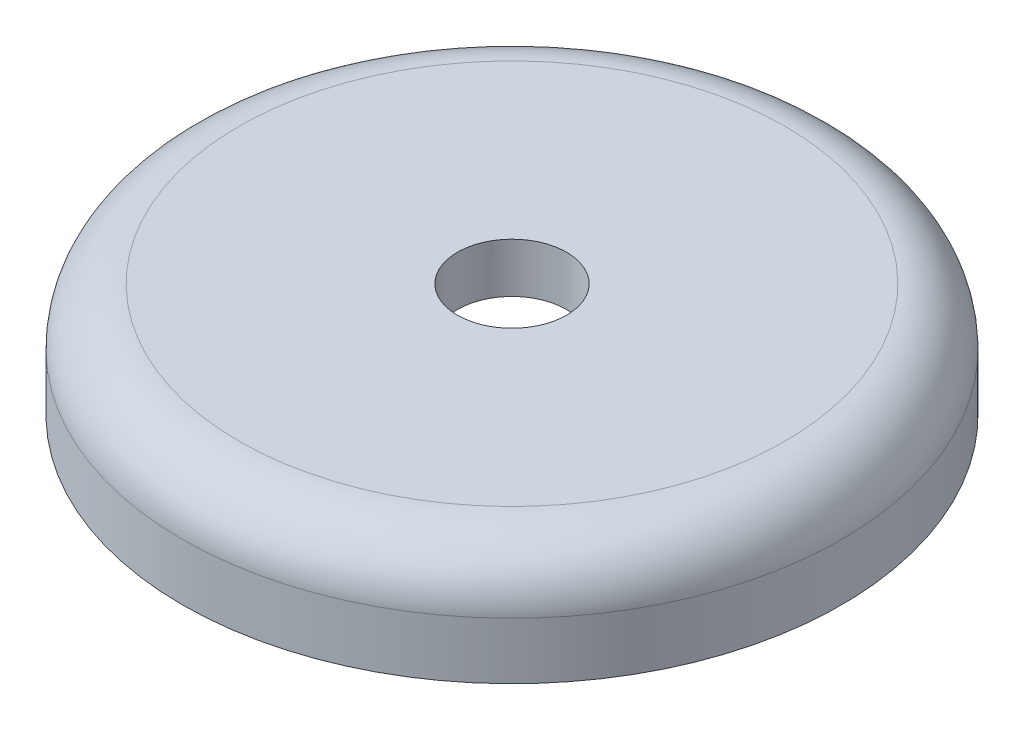
ISO-10303-21;
HEADER;
FILE_DESCRIPTION(('STEP AP214'),'2;1');
FILE_NAME('part.step','',(''),(''),'','','');
FILE_SCHEMA(('AUTOMOTIVE_DESIGN { 1 0 10303 214 1 1 1 1 }'));
ENDSEC;
DATA;
#1=APPLICATION_CONTEXT('core data for automotive mechanical design processes');
#2=APPLICATION_PROTOCOL_DEFINITION('international standard','automotive_design',2000,#1);
#3=PRODUCT_CONTEXT('',#1,'mechanical');
#4=PRODUCT('Part','Part','',(#3));
#5=PRODUCT_RELATED_PRODUCT_CATEGORY('part','',(#4));
#6=PRODUCT_DEFINITION_FORMATION('','',#4);
#7=PRODUCT_DEFINITION_CONTEXT('part definition',#1,'design');
#8=PRODUCT_DEFINITION('design','',#6,#7);
#9=PRODUCT_DEFINITION_SHAPE('','',#8);
#10=(LENGTH_UNIT() NAMED_UNIT(*) SI_UNIT(.MILLI.,.METRE.));
#11=(NAMED_UNIT(*) PLANE_ANGLE_UNIT() SI_UNIT($,.RADIAN.));
#12=(NAMED_UNIT(*) SI_UNIT($,.STERADIAN.) SOLID_ANGLE_UNIT());
#13=UNCERTAINTY_MEASURE_WITH_UNIT(LENGTH_MEASURE(1.E-05),#10,'distance_accuracy_value','');
#14=(GEOMETRIC_REPRESENTATION_CONTEXT(3) GLOBAL_UNCERTAINTY_ASSIGNED_CONTEXT((#13)) GLOBAL_UNIT_ASSIGNED_CONTEXT((#10,
#11,#12)) REPRESENTATION_CONTEXT('',''));
#15=CARTESIAN_POINT('',(0.,0.,0.));
#16=DIRECTION('',(0.,0.,1.));
#17=DIRECTION('',(1.,0.,0.));
#18=AXIS2_PLACEMENT_3D('',#15,#16,#17);
#19=CARTESIAN_POINT('',(0.,0.,0.));
#20=DIRECTION('',(0.,1.,0.));
#21=DIRECTION('',(0.,0.,1.));
#22=AXIS2_PLACEMENT_3D('',#19,#20,#21);
#23=CYLINDRICAL_SURFACE('',#22,9.779);
#24=CARTESIAN_POINT('',(0.,20.32,0.));
#25=DIRECTION('',(0.,1.,0.));
#26=DIRECTION('',(0.,0.,1.));
#27=AXIS2_PLACEMENT_3D('',#24,#25,#26);
#28=CIRCLE('',#27,9.779);
#29=CARTESIAN_POINT('',(0.,20.32,9.779));
#30=VERTEX_POINT('',#29);
#31=EDGE_CURVE('E51',#30,#30,#28,.T.);
#32=ORIENTED_EDGE('',*,*,#31,.T.);
#33=EDGE_LOOP('',(#32));
#34=FACE_BOUND('',#33,.T.);
#35=CARTESIAN_POINT('',(0.,11.43,0.));
#36=DIRECTION('',(0.,-1.,0.));
#37=DIRECTION('',(0.,0.,-1.));
#38=AXIS2_PLACEMENT_3D('',#35,#36,#37);
#39=CIRCLE('',#38,9.779);
#40=CARTESIAN_POINT('',(0.,11.43,-9.779));
#41=VERTEX_POINT('',#40);
#42=EDGE_CURVE('E62',#41,#41,#39,.T.);
#43=ORIENTED_EDGE('',*,*,#42,.T.);
#44=EDGE_LOOP('',(#43));
#45=FACE_BOUND('',#44,.T.);
#46=ADVANCED_FACE('F31',(#34,#45),#23,.F.);
#47=CARTESIAN_POINT('',(0.,20.32,0.));
#48=DIRECTION('',(0.,-1.,0.));
#49=DIRECTION('',(0.,0.,-1.));
#50=AXIS2_PLACEMENT_3D('',#47,#48,#49);
#51=CYLINDRICAL_SURFACE('',#50,59.055);
#52=CARTESIAN_POINT('',(0.,10.16,0.));
#53=DIRECTION('',(0.,1.,0.));
#54=DIRECTION('',(0.,0.,1.));
#55=AXIS2_PLACEMENT_3D('',#52,#53,#54);
#56=CIRCLE('',#55,59.055);
#57=CARTESIAN_POINT('',(0.,10.16,59.055));
#58=VERTEX_POINT('',#57);
#59=EDGE_CURVE('E38',#58,#58,#56,.F.);
#60=ORIENTED_EDGE('',*,*,#59,.T.);
#61=EDGE_LOOP('',(#60));
#62=FACE_BOUND('',#61,.T.);
#63=CARTESIAN_POINT('',(0.,0.,0.));
#64=DIRECTION('',(0.,1.,0.));
#65=DIRECTION('',(0.,0.,1.));
#66=AXIS2_PLACEMENT_3D('',#63,#64,#65);
#67=CIRCLE('',#66,59.055);
#68=CARTESIAN_POINT('',(0.,0.,59.055));
#69=VERTEX_POINT('',#68);
#70=EDGE_CURVE('E46',#69,#69,#67,.T.);
#71=ORIENTED_EDGE('',*,*,#70,.T.);
#72=EDGE_LOOP('',(#71));
#73=FACE_BOUND('',#72,.T.);
#74=ADVANCED_FACE('F85',(#62,#73),#51,.T.);
#75=CARTESIAN_POINT('',(0.,20.32,0.));
#76=DIRECTION('',(0.,1.,0.));
#77=DIRECTION('',(0.,0.,1.));
#78=AXIS2_PLACEMENT_3D('',#75,#76,#77);
#79=PLANE('',#78);
#80=CARTESIAN_POINT('',(0.,20.32,0.));
#81=DIRECTION('',(0.,1.,0.));
#82=DIRECTION('',(0.,0.,1.));
#83=AXIS2_PLACEMENT_3D('',#80,#81,#82);
#84=CIRCLE('',#83,48.895);
#85=CARTESIAN_POINT('',(0.,20.32,48.895));
#86=VERTEX_POINT('',#85);
#87=EDGE_CURVE('E42',#86,#86,#84,.T.);
#88=ORIENTED_EDGE('',*,*,#87,.T.);
#89=EDGE_LOOP('',(#88));
#90=FACE_BOUND('',#89,.T.);
#91=ORIENTED_EDGE('',*,*,#31,.F.);
#92=EDGE_LOOP('',(#91));
#93=FACE_BOUND('',#92,.T.);
#94=ADVANCED_FACE('F91',(#90,#93),#79,.T.);
#95=CARTESIAN_POINT('',(0.,0.,0.));
#96=DIRECTION('',(0.,1.,0.));
#97=DIRECTION('',(0.,0.,1.));
#98=AXIS2_PLACEMENT_3D('',#95,#96,#97);
#99=PLANE('',#98);
#100=CARTESIAN_POINT('',(0.,0.,0.));
#101=DIRECTION('',(0.,1.,0.));
#102=DIRECTION('',(0.,0.,1.));
#103=AXIS2_PLACEMENT_3D('',#100,#101,#102);
#104=CIRCLE('',#103,53.975);
#105=CARTESIAN_POINT('',(0.,0.,53.975));
#106=VERTEX_POINT('',#105);
#107=EDGE_CURVE('E55',#106,#106,#104,.T.);
#108=ORIENTED_EDGE('',*,*,#107,.T.);
#109=EDGE_LOOP('',(#108));
#110=FACE_BOUND('',#109,.T.);
#111=ORIENTED_EDGE('',*,*,#70,.F.);
#112=EDGE_LOOP('',(#111));
#113=FACE_BOUND('',#112,.T.);
#114=ADVANCED_FACE('F97',(#110,#113),#99,.F.);
#115=CARTESIAN_POINT('',(0.,10.16,0.));
#116=DIRECTION('',(0.,1.,0.));
#117=DIRECTION('',(0.,0.,1.));
#118=AXIS2_PLACEMENT_3D('',#115,#116,#117);
#119=TOROIDAL_SURFACE('',#118,48.895,10.16);
#120=ORIENTED_EDGE('',*,*,#59,.F.);
#121=EDGE_LOOP('',(#120));
#122=FACE_BOUND('',#121,.T.);
#123=ORIENTED_EDGE('',*,*,#87,.F.);
#124=EDGE_LOOP('',(#123));
#125=FACE_BOUND('',#124,.T.);
#126=ADVANCED_FACE('F100',(#122,#125),#119,.T.);
#127=CARTESIAN_POINT('',(0.,20.32,0.));
#128=DIRECTION('',(0.,-1.,0.));
#129=DIRECTION('',(0.,0.,-1.));
#130=AXIS2_PLACEMENT_3D('',#127,#128,#129);
#131=CYLINDRICAL_SURFACE('',#130,53.975);
#132=CARTESIAN_POINT('',(0.,10.16,0.));
#133=DIRECTION('',(0.,-1.,0.));
#134=DIRECTION('',(0.,0.,-1.));
#135=AXIS2_PLACEMENT_3D('',#132,#133,#134);
#136=CIRCLE('',#135,53.975);
#137=CARTESIAN_POINT('',(0.,10.16,-53.975));
#138=VERTEX_POINT('',#137);
#139=EDGE_CURVE('E54',#138,#138,#136,.T.);
#140=ORIENTED_EDGE('',*,*,#139,.F.);
#141=EDGE_LOOP('',(#140));
#142=FACE_BOUND('',#141,.T.);
#143=ORIENTED_EDGE('',*,*,#107,.F.);
#144=EDGE_LOOP('',(#143));
#145=FACE_BOUND('',#144,.T.);
#146=ADVANCED_FACE('F103',(#142,#145),#131,.F.);
#147=CARTESIAN_POINT('',(0.,15.24,0.));
#148=DIRECTION('',(0.,1.,0.));
#149=DIRECTION('',(0.,0.,1.));
#150=AXIS2_PLACEMENT_3D('',#147,#148,#149);
#151=PLANE('',#150);
#152=CARTESIAN_POINT('',(0.,15.24,0.));
#153=DIRECTION('',(0.,1.,0.));
#154=DIRECTION('',(0.,0.,1.));
#155=AXIS2_PLACEMENT_3D('',#152,#153,#154);
#156=CIRCLE('',#155,48.895);
#157=CARTESIAN_POINT('',(0.,15.24,48.895));
#158=VERTEX_POINT('',#157);
#159=EDGE_CURVE('E58',#158,#158,#156,.T.);
#160=ORIENTED_EDGE('',*,*,#159,.F.);
#161=EDGE_LOOP('',(#160));
#162=FACE_BOUND('',#161,.T.);
#163=CARTESIAN_POINT('',(0.,15.24,0.));
#164=DIRECTION('',(0.,1.,0.));
#165=DIRECTION('',(0.,0.,1.));
#166=AXIS2_PLACEMENT_3D('',#163,#164,#165);
#167=CIRCLE('',#166,14.859);
#168=CARTESIAN_POINT('',(0.,15.24,14.859));
#169=VERTEX_POINT('',#168);
#170=EDGE_CURVE('E59',#169,#169,#167,.T.);
#171=ORIENTED_EDGE('',*,*,#170,.T.);
#172=EDGE_LOOP('',(#171));
#173=FACE_BOUND('',#172,.T.);
#174=ADVANCED_FACE('F80',(#162,#173),#151,.F.);
#175=CARTESIAN_POINT('',(0.,10.16,0.));
#176=DIRECTION('',(0.,1.,0.));
#177=DIRECTION('',(0.,0.,1.));
#178=AXIS2_PLACEMENT_3D('',#175,#176,#177);
#179=TOROIDAL_SURFACE('',#178,48.895,5.08);
#180=ORIENTED_EDGE('',*,*,#139,.T.);
#181=EDGE_LOOP('',(#180));
#182=FACE_BOUND('',#181,.T.);
#183=ORIENTED_EDGE('',*,*,#159,.T.);
#184=EDGE_LOOP('',(#183));
#185=FACE_BOUND('',#184,.T.);
#186=ADVANCED_FACE('F73',(#182,#185),#179,.F.);
#187=CARTESIAN_POINT('',(0.,11.43,0.));
#188=DIRECTION('',(0.,-1.,0.));
#189=DIRECTION('',(0.,0.,-1.));
#190=AXIS2_PLACEMENT_3D('',#187,#188,#189);
#191=PLANE('',#190);
#192=CARTESIAN_POINT('',(0.,11.43,0.));
#193=DIRECTION('',(0.,-1.,0.));
#194=DIRECTION('',(0.,0.,-1.));
#195=AXIS2_PLACEMENT_3D('',#192,#193,#194);
#196=CIRCLE('',#195,9.94031115031658);
#197=CARTESIAN_POINT('',(0.,11.43,-9.94031115031658));
#198=VERTEX_POINT('',#197);
#199=EDGE_CURVE('E10',#198,#198,#196,.T.);
#200=ORIENTED_EDGE('',*,*,#199,.T.);
#201=EDGE_LOOP('',(#200));
#202=FACE_BOUND('',#201,.T.);
#203=ORIENTED_EDGE('',*,*,#42,.F.);
#204=EDGE_LOOP('',(#203));
#205=FACE_BOUND('',#204,.T.);
#206=ADVANCED_FACE('F71',(#202,#205),#191,.T.);
#207=CARTESIAN_POINT('',(0.,16.51,0.));
#208=DIRECTION('',(0.,1.,0.));
#209=DIRECTION('',(0.,0.,1.));
#210=AXIS2_PLACEMENT_3D('',#207,#208,#209);
#211=TOROIDAL_SURFACE('',#210,9.94031115031658,5.08);
#212=ORIENTED_EDGE('',*,*,#170,.F.);
#213=EDGE_LOOP('',(#212));
#214=FACE_BOUND('',#213,.T.);
#215=ORIENTED_EDGE('',*,*,#199,.F.);
#216=EDGE_LOOP('',(#215));
#217=FACE_BOUND('',#216,.T.);
#218=ADVANCED_FACE('F33',(#214,#217),#211,.T.);
#219=CLOSED_SHELL('',(#46,#74,#94,#114,#126,#146,#174,#186,#206,#218));
#220=MANIFOLD_SOLID_BREP('B2',#219);
#221=ADVANCED_BREP_SHAPE_REPRESENTATION('',(#18,#220),#14);
#222=SHAPE_DEFINITION_REPRESENTATION(#9,#221);
ENDSEC;
END-ISO-10303-21;
